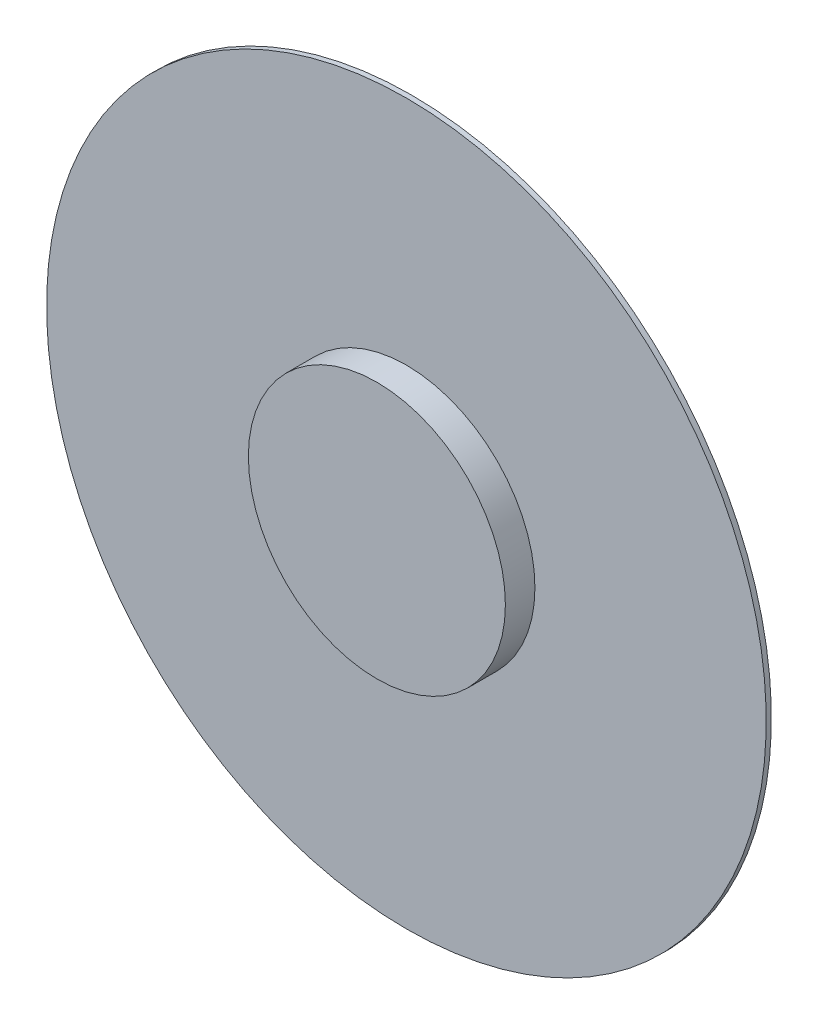
ISO-10303-21;
HEADER;
FILE_DESCRIPTION(('STEP AP214'),'2;1');
FILE_NAME('part.step','',(''),(''),'','','');
FILE_SCHEMA(('AUTOMOTIVE_DESIGN { 1 0 10303 214 1 1 1 1 }'));
ENDSEC;
DATA;
#1=APPLICATION_CONTEXT('core data for automotive mechanical design processes');
#2=APPLICATION_PROTOCOL_DEFINITION('international standard','automotive_design',2000,#1);
#3=PRODUCT_CONTEXT('',#1,'mechanical');
#4=PRODUCT('Part','Part','',(#3));
#5=PRODUCT_RELATED_PRODUCT_CATEGORY('part','',(#4));
#6=PRODUCT_DEFINITION_FORMATION('','',#4);
#7=PRODUCT_DEFINITION_CONTEXT('part definition',#1,'design');
#8=PRODUCT_DEFINITION('design','',#6,#7);
#9=PRODUCT_DEFINITION_SHAPE('','',#8);
#10=(LENGTH_UNIT() NAMED_UNIT(*) SI_UNIT(.MILLI.,.METRE.));
#11=(NAMED_UNIT(*) PLANE_ANGLE_UNIT() SI_UNIT($,.RADIAN.));
#12=(NAMED_UNIT(*) SI_UNIT($,.STERADIAN.) SOLID_ANGLE_UNIT());
#13=UNCERTAINTY_MEASURE_WITH_UNIT(LENGTH_MEASURE(1.E-05),#10,'distance_accuracy_value','');
#14=(GEOMETRIC_REPRESENTATION_CONTEXT(3) GLOBAL_UNCERTAINTY_ASSIGNED_CONTEXT((#13)) GLOBAL_UNIT_ASSIGNED_CONTEXT((#10,
#11,#12)) REPRESENTATION_CONTEXT('',''));
#15=CARTESIAN_POINT('',(0.,0.,0.));
#16=DIRECTION('',(0.,0.,1.));
#17=DIRECTION('',(1.,0.,0.));
#18=AXIS2_PLACEMENT_3D('',#15,#16,#17);
#19=CARTESIAN_POINT('',(0.,0.,-9.85));
#20=DIRECTION('',(0.,0.,-1.));
#21=DIRECTION('',(0.,1.,0.));
#22=AXIS2_PLACEMENT_3D('',#19,#20,#21);
#23=PLANE('',#22);
#24=CARTESIAN_POINT('',(0.,0.,-9.85));
#25=DIRECTION('',(0.,0.,-1.));
#26=DIRECTION('',(0.,1.,0.));
#27=AXIS2_PLACEMENT_3D('',#24,#25,#26);
#28=CIRCLE('',#27,5.);
#29=CARTESIAN_POINT('',(0.,5.,-9.85));
#30=VERTEX_POINT('',#29);
#31=EDGE_CURVE('E18',#30,#30,#28,.F.);
#32=ORIENTED_EDGE('',*,*,#31,.F.);
#33=EDGE_LOOP('',(#32));
#34=FACE_BOUND('',#33,.T.);
#35=ADVANCED_FACE('F15',(#34),#23,.T.);
#36=CARTESIAN_POINT('',(0.,0.,-7.35));
#37=DIRECTION('',(0.,0.,-1.));
#38=DIRECTION('',(0.,1.,0.));
#39=AXIS2_PLACEMENT_3D('',#36,#37,#38);
#40=CYLINDRICAL_SURFACE('',#39,5.);
#41=CARTESIAN_POINT('',(0.,0.,-8.7));
#42=DIRECTION('',(0.,0.,-1.));
#43=DIRECTION('',(0.,1.,0.));
#44=AXIS2_PLACEMENT_3D('',#41,#42,#43);
#45=CIRCLE('',#44,5.);
#46=CARTESIAN_POINT('',(0.,5.,-8.7));
#47=VERTEX_POINT('',#46);
#48=EDGE_CURVE('E34',#47,#47,#45,.F.);
#49=ORIENTED_EDGE('',*,*,#48,.F.);
#50=EDGE_LOOP('',(#49));
#51=FACE_BOUND('',#50,.T.);
#52=ORIENTED_EDGE('',*,*,#31,.T.);
#53=EDGE_LOOP('',(#52));
#54=FACE_BOUND('',#53,.T.);
#55=ADVANCED_FACE('F41',(#51,#54),#40,.T.);
#56=CARTESIAN_POINT('',(0.,0.,-8.7));
#57=DIRECTION('',(0.,0.,-1.));
#58=DIRECTION('',(0.,1.,0.));
#59=AXIS2_PLACEMENT_3D('',#56,#57,#58);
#60=PLANE('',#59);
#61=ORIENTED_EDGE('',*,*,#48,.T.);
#62=EDGE_LOOP('',(#61));
#63=FACE_BOUND('',#62,.T.);
#64=CARTESIAN_POINT('',(0.,0.,-8.7));
#65=DIRECTION('',(0.,0.,1.));
#66=DIRECTION('',(0.,-1.,0.));
#67=AXIS2_PLACEMENT_3D('',#64,#65,#66);
#68=CIRCLE('',#67,14.);
#69=CARTESIAN_POINT('',(0.,-14.,-8.7));
#70=VERTEX_POINT('',#69);
#71=EDGE_CURVE('E32',#70,#70,#68,.T.);
#72=ORIENTED_EDGE('',*,*,#71,.F.);
#73=EDGE_LOOP('',(#72));
#74=FACE_BOUND('',#73,.T.);
#75=ADVANCED_FACE('F48',(#63,#74),#60,.T.);
#76=CARTESIAN_POINT('',(0.,0.,-7.35));
#77=DIRECTION('',(0.,0.,-1.));
#78=DIRECTION('',(0.,1.,0.));
#79=AXIS2_PLACEMENT_3D('',#76,#77,#78);
#80=PLANE('',#79);
#81=CARTESIAN_POINT('',(0.,0.,-7.35));
#82=DIRECTION('',(0.,0.,-1.));
#83=DIRECTION('',(0.,1.,0.));
#84=AXIS2_PLACEMENT_3D('',#81,#82,#83);
#85=CIRCLE('',#84,5.);
#86=CARTESIAN_POINT('',(0.,5.,-7.35));
#87=VERTEX_POINT('',#86);
#88=EDGE_CURVE('E27',#87,#87,#85,.T.);
#89=ORIENTED_EDGE('',*,*,#88,.F.);
#90=EDGE_LOOP('',(#89));
#91=FACE_BOUND('',#90,.T.);
#92=ADVANCED_FACE('F65',(#91),#80,.F.);
#93=CARTESIAN_POINT('',(0.,0.,-8.49999999999999));
#94=DIRECTION('',(0.,0.,1.));
#95=DIRECTION('',(0.,-1.,0.));
#96=AXIS2_PLACEMENT_3D('',#93,#94,#95);
#97=CYLINDRICAL_SURFACE('',#96,14.);
#98=CARTESIAN_POINT('',(0.,0.,-8.49999999999999));
#99=DIRECTION('',(0.,0.,1.));
#100=DIRECTION('',(0.,-1.,0.));
#101=AXIS2_PLACEMENT_3D('',#98,#99,#100);
#102=CIRCLE('',#101,14.);
#103=CARTESIAN_POINT('',(0.,-14.,-8.49999999999999));
#104=VERTEX_POINT('',#103);
#105=EDGE_CURVE('E22',#104,#104,#102,.F.);
#106=ORIENTED_EDGE('',*,*,#105,.T.);
#107=EDGE_LOOP('',(#106));
#108=FACE_BOUND('',#107,.T.);
#109=ORIENTED_EDGE('',*,*,#71,.T.);
#110=EDGE_LOOP('',(#109));
#111=FACE_BOUND('',#110,.T.);
#112=ADVANCED_FACE('F58',(#108,#111),#97,.T.);
#113=CARTESIAN_POINT('',(0.,0.,-7.35));
#114=DIRECTION('',(0.,0.,-1.));
#115=DIRECTION('',(0.,1.,0.));
#116=AXIS2_PLACEMENT_3D('',#113,#114,#115);
#117=CYLINDRICAL_SURFACE('',#116,5.);
#118=ORIENTED_EDGE('',*,*,#88,.T.);
#119=EDGE_LOOP('',(#118));
#120=FACE_BOUND('',#119,.T.);
#121=CARTESIAN_POINT('',(0.,0.,-8.49999999999999));
#122=DIRECTION('',(0.,0.,-1.));
#123=DIRECTION('',(0.,1.,0.));
#124=AXIS2_PLACEMENT_3D('',#121,#122,#123);
#125=CIRCLE('',#124,5.);
#126=CARTESIAN_POINT('',(0.,5.,-8.49999999999999));
#127=VERTEX_POINT('',#126);
#128=EDGE_CURVE('E10',#127,#127,#125,.F.);
#129=ORIENTED_EDGE('',*,*,#128,.T.);
#130=EDGE_LOOP('',(#129));
#131=FACE_BOUND('',#130,.T.);
#132=ADVANCED_FACE('F52',(#120,#131),#117,.T.);
#133=CARTESIAN_POINT('',(0.,0.,-8.49999999999999));
#134=DIRECTION('',(0.,0.,-1.));
#135=DIRECTION('',(0.,1.,0.));
#136=AXIS2_PLACEMENT_3D('',#133,#134,#135);
#137=PLANE('',#136);
#138=ORIENTED_EDGE('',*,*,#128,.F.);
#139=EDGE_LOOP('',(#138));
#140=FACE_BOUND('',#139,.T.);
#141=ORIENTED_EDGE('',*,*,#105,.F.);
#142=EDGE_LOOP('',(#141));
#143=FACE_BOUND('',#142,.T.);
#144=ADVANCED_FACE('F50',(#140,#143),#137,.F.);
#145=CLOSED_SHELL('',(#35,#55,#75,#92,#112,#132,#144));
#146=MANIFOLD_SOLID_BREP('B1',#145);
#147=ADVANCED_BREP_SHAPE_REPRESENTATION('',(#18,#146),#14);
#148=SHAPE_DEFINITION_REPRESENTATION(#9,#147);
ENDSEC;
END-ISO-10303-21;
